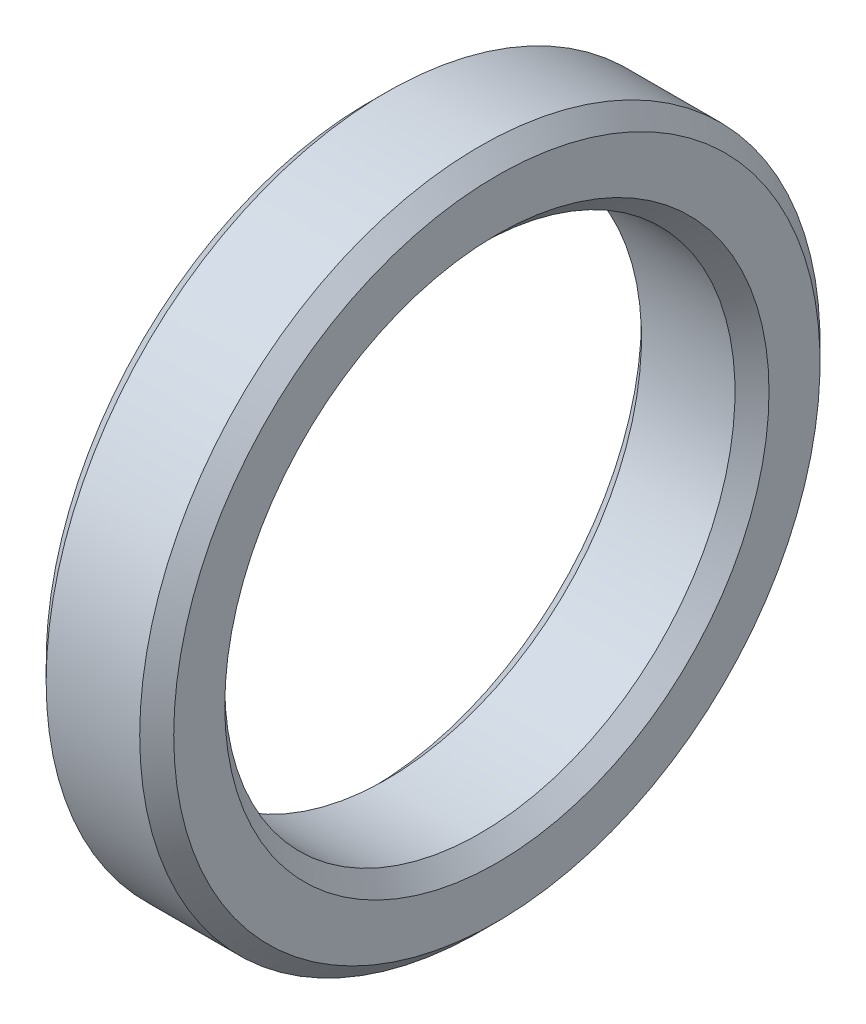
ISO-10303-21;
HEADER;
FILE_DESCRIPTION(('STEP AP214'),'2;1');
FILE_NAME('part.step','',(''),(''),'','','');
FILE_SCHEMA(('AUTOMOTIVE_DESIGN { 1 0 10303 214 1 1 1 1 }'));
ENDSEC;
DATA;
#1=APPLICATION_CONTEXT('core data for automotive mechanical design processes');
#2=APPLICATION_PROTOCOL_DEFINITION('international standard','automotive_design',2000,#1);
#3=PRODUCT_CONTEXT('',#1,'mechanical');
#4=PRODUCT('Part','Part','',(#3));
#5=PRODUCT_RELATED_PRODUCT_CATEGORY('part','',(#4));
#6=PRODUCT_DEFINITION_FORMATION('','',#4);
#7=PRODUCT_DEFINITION_CONTEXT('part definition',#1,'design');
#8=PRODUCT_DEFINITION('design','',#6,#7);
#9=PRODUCT_DEFINITION_SHAPE('','',#8);
#10=(LENGTH_UNIT() NAMED_UNIT(*) SI_UNIT(.MILLI.,.METRE.));
#11=(NAMED_UNIT(*) PLANE_ANGLE_UNIT() SI_UNIT($,.RADIAN.));
#12=(NAMED_UNIT(*) SI_UNIT($,.STERADIAN.) SOLID_ANGLE_UNIT());
#13=UNCERTAINTY_MEASURE_WITH_UNIT(LENGTH_MEASURE(1.E-05),#10,'distance_accuracy_value','');
#14=(GEOMETRIC_REPRESENTATION_CONTEXT(3) GLOBAL_UNCERTAINTY_ASSIGNED_CONTEXT((#13)) GLOBAL_UNIT_ASSIGNED_CONTEXT((#10,
#11,#12)) REPRESENTATION_CONTEXT('',''));
#15=CARTESIAN_POINT('',(0.,0.,0.));
#16=DIRECTION('',(0.,0.,1.));
#17=DIRECTION('',(1.,0.,0.));
#18=AXIS2_PLACEMENT_3D('',#15,#16,#17);
#19=CARTESIAN_POINT('',(0.,3.,0.));
#20=DIRECTION('',(1.,0.,0.));
#21=DIRECTION('',(0.,0.,-1.));
#22=AXIS2_PLACEMENT_3D('',#19,#20,#21);
#23=PLANE('',#22);
#24=CARTESIAN_POINT('',(0.,0.,0.));
#25=DIRECTION('',(1.,0.,0.));
#26=DIRECTION('',(0.,0.,-1.));
#27=AXIS2_PLACEMENT_3D('',#24,#25,#26);
#28=CIRCLE('',#27,3.2);
#29=CARTESIAN_POINT('',(0.,0.,3.2));
#30=VERTEX_POINT('',#29);
#31=EDGE_CURVE('E66',#30,#30,#28,.T.);
#32=ORIENTED_EDGE('',*,*,#31,.T.);
#33=EDGE_LOOP('',(#32));
#34=FACE_BOUND('',#33,.T.);
#35=CARTESIAN_POINT('',(0.,0.,0.));
#36=DIRECTION('',(1.,0.,0.));
#37=DIRECTION('',(0.,0.,-1.));
#38=AXIS2_PLACEMENT_3D('',#35,#36,#37);
#39=CIRCLE('',#38,3.8);
#40=CARTESIAN_POINT('',(0.,0.,-3.8));
#41=VERTEX_POINT('',#40);
#42=EDGE_CURVE('E70',#41,#41,#39,.F.);
#43=ORIENTED_EDGE('',*,*,#42,.T.);
#44=EDGE_LOOP('',(#43));
#45=FACE_BOUND('',#44,.T.);
#46=ADVANCED_FACE('F40',(#34,#45),#23,.F.);
#47=CARTESIAN_POINT('',(0.,0.,0.));
#48=DIRECTION('',(-1.,0.,0.));
#49=DIRECTION('',(0.,0.,1.));
#50=AXIS2_PLACEMENT_3D('',#47,#48,#49);
#51=CYLINDRICAL_SURFACE('',#50,4.);
#52=CARTESIAN_POINT('',(0.199999999999995,0.,0.));
#53=DIRECTION('',(1.,0.,0.));
#54=DIRECTION('',(0.,0.,-1.));
#55=AXIS2_PLACEMENT_3D('',#52,#53,#54);
#56=CIRCLE('',#55,4.);
#57=CARTESIAN_POINT('',(0.199999999999995,0.,-4.));
#58=VERTEX_POINT('',#57);
#59=EDGE_CURVE('E54',#58,#58,#56,.T.);
#60=ORIENTED_EDGE('',*,*,#59,.T.);
#61=EDGE_LOOP('',(#60));
#62=FACE_BOUND('',#61,.T.);
#63=CARTESIAN_POINT('',(1.3,0.,0.));
#64=DIRECTION('',(-1.,0.,0.));
#65=DIRECTION('',(0.,0.,1.));
#66=AXIS2_PLACEMENT_3D('',#63,#64,#65);
#67=CIRCLE('',#66,4.);
#68=CARTESIAN_POINT('',(1.3,0.,4.));
#69=VERTEX_POINT('',#68);
#70=EDGE_CURVE('E60',#69,#69,#67,.T.);
#71=ORIENTED_EDGE('',*,*,#70,.T.);
#72=EDGE_LOOP('',(#71));
#73=FACE_BOUND('',#72,.T.);
#74=ADVANCED_FACE('F99',(#62,#73),#51,.T.);
#75=CARTESIAN_POINT('',(1.5,3.,0.));
#76=DIRECTION('',(-1.,0.,0.));
#77=DIRECTION('',(0.,0.,1.));
#78=AXIS2_PLACEMENT_3D('',#75,#76,#77);
#79=PLANE('',#78);
#80=CARTESIAN_POINT('',(1.5,0.,0.));
#81=DIRECTION('',(-1.,0.,0.));
#82=DIRECTION('',(0.,0.,1.));
#83=AXIS2_PLACEMENT_3D('',#80,#81,#82);
#84=CIRCLE('',#83,3.2);
#85=CARTESIAN_POINT('',(1.5,0.,3.2));
#86=VERTEX_POINT('',#85);
#87=EDGE_CURVE('E10',#86,#86,#84,.T.);
#88=ORIENTED_EDGE('',*,*,#87,.T.);
#89=EDGE_LOOP('',(#88));
#90=FACE_BOUND('',#89,.T.);
#91=CARTESIAN_POINT('',(1.5,0.,0.));
#92=DIRECTION('',(-1.,0.,0.));
#93=DIRECTION('',(0.,0.,1.));
#94=AXIS2_PLACEMENT_3D('',#91,#92,#93);
#95=CIRCLE('',#94,3.8);
#96=CARTESIAN_POINT('',(1.5,0.,3.8));
#97=VERTEX_POINT('',#96);
#98=EDGE_CURVE('E48',#97,#97,#95,.F.);
#99=ORIENTED_EDGE('',*,*,#98,.T.);
#100=EDGE_LOOP('',(#99));
#101=FACE_BOUND('',#100,.T.);
#102=ADVANCED_FACE('F105',(#90,#101),#79,.F.);
#103=CARTESIAN_POINT('',(0.,0.,0.));
#104=DIRECTION('',(-1.,0.,0.));
#105=DIRECTION('',(0.,0.,1.));
#106=AXIS2_PLACEMENT_3D('',#103,#104,#105);
#107=CYLINDRICAL_SURFACE('',#106,3.);
#108=CARTESIAN_POINT('',(0.199999999999999,0.,0.));
#109=DIRECTION('',(1.,0.,0.));
#110=DIRECTION('',(0.,0.,-1.));
#111=AXIS2_PLACEMENT_3D('',#108,#109,#110);
#112=CIRCLE('',#111,3.);
#113=CARTESIAN_POINT('',(0.199999999999999,0.,3.));
#114=VERTEX_POINT('',#113);
#115=EDGE_CURVE('E74',#114,#114,#112,.F.);
#116=ORIENTED_EDGE('',*,*,#115,.T.);
#117=EDGE_LOOP('',(#116));
#118=FACE_BOUND('',#117,.T.);
#119=CARTESIAN_POINT('',(1.3,0.,0.));
#120=DIRECTION('',(-1.,0.,0.));
#121=DIRECTION('',(0.,0.,1.));
#122=AXIS2_PLACEMENT_3D('',#119,#120,#121);
#123=CIRCLE('',#122,3.);
#124=CARTESIAN_POINT('',(1.3,0.,3.));
#125=VERTEX_POINT('',#124);
#126=EDGE_CURVE('E78',#125,#125,#123,.F.);
#127=ORIENTED_EDGE('',*,*,#126,.T.);
#128=EDGE_LOOP('',(#127));
#129=FACE_BOUND('',#128,.T.);
#130=ADVANCED_FACE('F84',(#118,#129),#107,.F.);
#131=CARTESIAN_POINT('',(0.199999999999999,0.,0.));
#132=DIRECTION('',(-1.,0.,0.));
#133=DIRECTION('',(0.,0.,1.));
#134=AXIS2_PLACEMENT_3D('',#131,#132,#133);
#135=CONICAL_SURFACE('',#134,3.,0.785398163397449);
#136=CARTESIAN_POINT('',(0.,0.,3.2));
#137=CARTESIAN_POINT('',(0.00208333333333336,0.,3.19791666666667));
#138=CARTESIAN_POINT('',(0.00416666666666668,0.,3.19583333333333));
#139=CARTESIAN_POINT('',(0.00833333333333331,0.,3.19166666666667));
#140=CARTESIAN_POINT('',(0.0104166666666666,0.,3.18958333333333));
#141=CARTESIAN_POINT('',(0.0145833333333332,0.,3.18541666666667));
#142=CARTESIAN_POINT('',(0.0166666666666665,0.,3.18333333333333));
#143=CARTESIAN_POINT('',(0.0208333333333332,0.,3.17916666666667));
#144=CARTESIAN_POINT('',(0.0229166666666666,0.,3.17708333333333));
#145=CARTESIAN_POINT('',(0.0270833333333332,0.,3.17291666666667));
#146=CARTESIAN_POINT('',(0.0291666666666665,0.,3.17083333333333));
#147=CARTESIAN_POINT('',(0.0333333333333332,0.,3.16666666666667));
#148=CARTESIAN_POINT('',(0.0354166666666666,0.,3.16458333333333));
#149=CARTESIAN_POINT('',(0.0395833333333332,0.,3.16041666666667));
#150=CARTESIAN_POINT('',(0.0416666666666665,0.,3.15833333333333));
#151=CARTESIAN_POINT('',(0.0458333333333331,0.,3.15416666666667));
#152=CARTESIAN_POINT('',(0.0479166666666665,0.,3.15208333333333));
#153=CARTESIAN_POINT('',(0.0520833333333332,0.,3.14791666666667));
#154=CARTESIAN_POINT('',(0.0541666666666665,0.,3.14583333333333));
#155=CARTESIAN_POINT('',(0.0583333333333331,0.,3.14166666666667));
#156=CARTESIAN_POINT('',(0.0604166666666664,0.,3.13958333333333));
#157=CARTESIAN_POINT('',(0.0645833333333331,0.,3.13541666666667));
#158=CARTESIAN_POINT('',(0.0666666666666664,0.,3.13333333333333));
#159=CARTESIAN_POINT('',(0.0708333333333331,0.,3.12916666666667));
#160=CARTESIAN_POINT('',(0.0729166666666664,0.,3.12708333333333));
#161=CARTESIAN_POINT('',(0.077083333333333,0.,3.12291666666667));
#162=CARTESIAN_POINT('',(0.0791666666666664,0.,3.12083333333333));
#163=CARTESIAN_POINT('',(0.083333333333333,0.,3.11666666666667));
#164=CARTESIAN_POINT('',(0.0854166666666663,0.,3.11458333333333));
#165=CARTESIAN_POINT('',(0.0895833333333329,0.,3.11041666666667));
#166=CARTESIAN_POINT('',(0.0916666666666663,0.,3.10833333333333));
#167=CARTESIAN_POINT('',(0.095833333333333,0.,3.10416666666667));
#168=CARTESIAN_POINT('',(0.0979166666666662,0.,3.10208333333333));
#169=CARTESIAN_POINT('',(0.102083333333333,0.,3.09791666666667));
#170=CARTESIAN_POINT('',(0.104166666666666,0.,3.09583333333333));
#171=CARTESIAN_POINT('',(0.108333333333333,0.,3.09166666666667));
#172=CARTESIAN_POINT('',(0.110416666666666,0.,3.08958333333333));
#173=CARTESIAN_POINT('',(0.114583333333333,0.,3.08541666666667));
#174=CARTESIAN_POINT('',(0.116666666666666,0.,3.08333333333333));
#175=CARTESIAN_POINT('',(0.120833333333333,0.,3.07916666666667));
#176=CARTESIAN_POINT('',(0.122916666666666,0.,3.07708333333333));
#177=CARTESIAN_POINT('',(0.127083333333333,0.,3.07291666666667));
#178=CARTESIAN_POINT('',(0.129166666666666,0.,3.07083333333333));
#179=CARTESIAN_POINT('',(0.133333333333333,0.,3.06666666666667));
#180=CARTESIAN_POINT('',(0.135416666666666,0.,3.06458333333333));
#181=CARTESIAN_POINT('',(0.139583333333333,0.,3.06041666666667));
#182=CARTESIAN_POINT('',(0.141666666666666,0.,3.05833333333333));
#183=CARTESIAN_POINT('',(0.145833333333333,0.,3.05416666666667));
#184=CARTESIAN_POINT('',(0.147916666666666,0.,3.05208333333333));
#185=CARTESIAN_POINT('',(0.152083333333333,0.,3.04791666666667));
#186=CARTESIAN_POINT('',(0.154166666666666,0.,3.04583333333333));
#187=CARTESIAN_POINT('',(0.158333333333333,0.,3.04166666666667));
#188=CARTESIAN_POINT('',(0.160416666666666,0.,3.03958333333333));
#189=CARTESIAN_POINT('',(0.164583333333333,0.,3.03541666666667));
#190=CARTESIAN_POINT('',(0.166666666666666,0.,3.03333333333333));
#191=CARTESIAN_POINT('',(0.170833333333333,0.,3.02916666666667));
#192=CARTESIAN_POINT('',(0.172916666666666,0.,3.02708333333333));
#193=CARTESIAN_POINT('',(0.177083333333333,0.,3.02291666666667));
#194=CARTESIAN_POINT('',(0.179166666666666,0.,3.02083333333333));
#195=CARTESIAN_POINT('',(0.183333333333333,0.,3.01666666666667));
#196=CARTESIAN_POINT('',(0.185416666666666,0.,3.01458333333333));
#197=CARTESIAN_POINT('',(0.189583333333333,0.,3.01041666666667));
#198=CARTESIAN_POINT('',(0.191666666666666,0.,3.00833333333333));
#199=CARTESIAN_POINT('',(0.195833333333333,0.,3.00416666666667));
#200=CARTESIAN_POINT('',(0.197916666666666,0.,3.00208333333333));
#201=CARTESIAN_POINT('',(0.199999999999999,0.,3.));
#202=B_SPLINE_CURVE_WITH_KNOTS('',3,(#136,#137,#138,#139,#140,#141,#142,#143,#144,#145,#146,
#147,#148,#149,#150,#151,#152,#153,#154,#155,#156,#157,#158,#159,#160,#161,#162,#163,#164,#165,
#166,#167,#168,#169,#170,#171,#172,#173,#174,#175,#176,#177,#178,#179,#180,#181,#182,#183,#184,
#185,#186,#187,#188,#189,#190,#191,#192,#193,#194,#195,#196,#197,#198,#199,#200,#201),
.UNSPECIFIED.,.F.,.F.,(4,2,2,2,2,2,2,2,2,2,2,2,2,2,2,2,2,2,2,2,2,2,2,2,2,2,2,2,2,2,2,2,4),(0.,
0.00883883476483166,0.0176776695296636,0.0265165042944956,0.0353553390593272,0.0441941738241592,
0.0530330085889908,0.0618718433538228,0.0707106781186544,0.0795495128834864,0.0883883476483183,
0.09722718241315,0.106066017177982,0.114904851942814,0.123743686707646,0.132582521472477,
0.141421356237309,0.150260191002141,0.159099025766973,0.167937860531805,0.176776695296636,
0.185615530061468,0.1944543648263,0.203293199591132,0.212132034355964,0.220970869120796,
0.229809703885627,0.238648538650459,0.247487373415291,0.256326208180123,0.265165042944955,
0.274003877709786,0.282842712474618),.UNSPECIFIED.);
#203=EDGE_CURVE('BSEAM95',#30,#114,#202,.T.);
#204=ORIENTED_EDGE('',*,*,#31,.F.);
#205=ORIENTED_EDGE('',*,*,#115,.F.);
#206=ORIENTED_EDGE('',*,*,#203,.T.);
#207=ORIENTED_EDGE('',*,*,#203,.F.);
#208=EDGE_LOOP('',(#204,#206,#205,#207));
#209=FACE_BOUND('',#208,.T.);
#210=ADVANCED_FACE('F95',(#209),#135,.F.);
#211=CARTESIAN_POINT('',(0.,0.,0.));
#212=DIRECTION('',(1.,0.,0.));
#213=DIRECTION('',(0.,0.,-1.));
#214=AXIS2_PLACEMENT_3D('',#211,#212,#213);
#215=CONICAL_SURFACE('',#214,3.8,0.785398163397448);
#216=ORIENTED_EDGE('',*,*,#59,.F.);
#217=EDGE_LOOP('',(#216));
#218=FACE_BOUND('',#217,.T.);
#219=ORIENTED_EDGE('',*,*,#42,.F.);
#220=EDGE_LOOP('',(#219));
#221=FACE_BOUND('',#220,.T.);
#222=ADVANCED_FACE('F89',(#218,#221),#215,.T.);
#223=CARTESIAN_POINT('',(1.5,0.,0.));
#224=DIRECTION('',(1.,0.,0.));
#225=DIRECTION('',(0.,0.,-1.));
#226=AXIS2_PLACEMENT_3D('',#223,#224,#225);
#227=CONICAL_SURFACE('',#226,3.2,0.785398163397443);
#228=ORIENTED_EDGE('',*,*,#126,.F.);
#229=EDGE_LOOP('',(#228));
#230=FACE_BOUND('',#229,.T.);
#231=ORIENTED_EDGE('',*,*,#87,.F.);
#232=EDGE_LOOP('',(#231));
#233=FACE_BOUND('',#232,.T.);
#234=ADVANCED_FACE('F86',(#230,#233),#227,.F.);
#235=CARTESIAN_POINT('',(1.3,0.,0.));
#236=DIRECTION('',(-1.,0.,0.));
#237=DIRECTION('',(0.,0.,1.));
#238=AXIS2_PLACEMENT_3D('',#235,#236,#237);
#239=CONICAL_SURFACE('',#238,4.,0.785398163397453);
#240=CARTESIAN_POINT('',(1.5,0.,3.8));
#241=CARTESIAN_POINT('',(1.49791666666667,0.,3.80208333333333));
#242=CARTESIAN_POINT('',(1.49583333333333,0.,3.80416666666667));
#243=CARTESIAN_POINT('',(1.49166666666667,0.,3.80833333333333));
#244=CARTESIAN_POINT('',(1.48958333333333,0.,3.81041666666667));
#245=CARTESIAN_POINT('',(1.48541666666667,0.,3.81458333333333));
#246=CARTESIAN_POINT('',(1.48333333333333,0.,3.81666666666667));
#247=CARTESIAN_POINT('',(1.47916666666667,0.,3.82083333333333));
#248=CARTESIAN_POINT('',(1.47708333333333,0.,3.82291666666667));
#249=CARTESIAN_POINT('',(1.47291666666667,0.,3.82708333333333));
#250=CARTESIAN_POINT('',(1.47083333333333,0.,3.82916666666667));
#251=CARTESIAN_POINT('',(1.46666666666667,0.,3.83333333333333));
#252=CARTESIAN_POINT('',(1.46458333333333,0.,3.83541666666667));
#253=CARTESIAN_POINT('',(1.46041666666667,0.,3.83958333333333));
#254=CARTESIAN_POINT('',(1.45833333333333,0.,3.84166666666667));
#255=CARTESIAN_POINT('',(1.45416666666667,0.,3.84583333333333));
#256=CARTESIAN_POINT('',(1.45208333333333,0.,3.84791666666667));
#257=CARTESIAN_POINT('',(1.44791666666667,0.,3.85208333333333));
#258=CARTESIAN_POINT('',(1.44583333333333,0.,3.85416666666667));
#259=CARTESIAN_POINT('',(1.44166666666667,0.,3.85833333333333));
#260=CARTESIAN_POINT('',(1.43958333333333,0.,3.86041666666667));
#261=CARTESIAN_POINT('',(1.43541666666667,0.,3.86458333333333));
#262=CARTESIAN_POINT('',(1.43333333333333,0.,3.86666666666667));
#263=CARTESIAN_POINT('',(1.42916666666667,0.,3.87083333333333));
#264=CARTESIAN_POINT('',(1.42708333333333,0.,3.87291666666667));
#265=CARTESIAN_POINT('',(1.42291666666667,0.,3.87708333333333));
#266=CARTESIAN_POINT('',(1.42083333333333,0.,3.87916666666667));
#267=CARTESIAN_POINT('',(1.41666666666667,0.,3.88333333333333));
#268=CARTESIAN_POINT('',(1.41458333333333,0.,3.88541666666667));
#269=CARTESIAN_POINT('',(1.41041666666667,0.,3.88958333333333));
#270=CARTESIAN_POINT('',(1.40833333333333,0.,3.89166666666667));
#271=CARTESIAN_POINT('',(1.40416666666667,0.,3.89583333333333));
#272=CARTESIAN_POINT('',(1.40208333333333,0.,3.89791666666667));
#273=CARTESIAN_POINT('',(1.39791666666667,0.,3.90208333333333));
#274=CARTESIAN_POINT('',(1.39583333333333,0.,3.90416666666667));
#275=CARTESIAN_POINT('',(1.39166666666667,0.,3.90833333333333));
#276=CARTESIAN_POINT('',(1.38958333333333,0.,3.91041666666667));
#277=CARTESIAN_POINT('',(1.38541666666667,0.,3.91458333333333));
#278=CARTESIAN_POINT('',(1.38333333333333,0.,3.91666666666667));
#279=CARTESIAN_POINT('',(1.37916666666667,0.,3.92083333333333));
#280=CARTESIAN_POINT('',(1.37708333333333,0.,3.92291666666667));
#281=CARTESIAN_POINT('',(1.37291666666667,0.,3.92708333333333));
#282=CARTESIAN_POINT('',(1.37083333333333,0.,3.92916666666667));
#283=CARTESIAN_POINT('',(1.36666666666667,0.,3.93333333333333));
#284=CARTESIAN_POINT('',(1.36458333333333,0.,3.93541666666667));
#285=CARTESIAN_POINT('',(1.36041666666667,0.,3.93958333333333));
#286=CARTESIAN_POINT('',(1.35833333333333,0.,3.94166666666667));
#287=CARTESIAN_POINT('',(1.35416666666667,0.,3.94583333333333));
#288=CARTESIAN_POINT('',(1.35208333333333,0.,3.94791666666667));
#289=CARTESIAN_POINT('',(1.34791666666667,0.,3.95208333333333));
#290=CARTESIAN_POINT('',(1.34583333333333,0.,3.95416666666667));
#291=CARTESIAN_POINT('',(1.34166666666667,0.,3.95833333333333));
#292=CARTESIAN_POINT('',(1.33958333333333,0.,3.96041666666667));
#293=CARTESIAN_POINT('',(1.33541666666667,0.,3.96458333333333));
#294=CARTESIAN_POINT('',(1.33333333333333,0.,3.96666666666667));
#295=CARTESIAN_POINT('',(1.32916666666667,0.,3.97083333333333));
#296=CARTESIAN_POINT('',(1.32708333333333,0.,3.97291666666667));
#297=CARTESIAN_POINT('',(1.32291666666667,0.,3.97708333333333));
#298=CARTESIAN_POINT('',(1.32083333333333,0.,3.97916666666667));
#299=CARTESIAN_POINT('',(1.31666666666667,0.,3.98333333333333));
#300=CARTESIAN_POINT('',(1.31458333333333,0.,3.98541666666667));
#301=CARTESIAN_POINT('',(1.31041666666667,0.,3.98958333333333));
#302=CARTESIAN_POINT('',(1.30833333333333,0.,3.99166666666667));
#303=CARTESIAN_POINT('',(1.30416666666667,0.,3.99583333333333));
#304=CARTESIAN_POINT('',(1.30208333333333,0.,3.99791666666667));
#305=CARTESIAN_POINT('',(1.3,0.,4.));
#306=B_SPLINE_CURVE_WITH_KNOTS('',3,(#240,#241,#242,#243,#244,#245,#246,#247,#248,#249,#250,
#251,#252,#253,#254,#255,#256,#257,#258,#259,#260,#261,#262,#263,#264,#265,#266,#267,#268,#269,
#270,#271,#272,#273,#274,#275,#276,#277,#278,#279,#280,#281,#282,#283,#284,#285,#286,#287,#288,
#289,#290,#291,#292,#293,#294,#295,#296,#297,#298,#299,#300,#301,#302,#303,#304,#305),
.UNSPECIFIED.,.F.,.F.,(4,2,2,2,2,2,2,2,2,2,2,2,2,2,2,2,2,2,2,2,2,2,2,2,2,2,2,2,2,2,2,2,4),(0.,
0.00883883476483164,0.0176776695296637,0.0265165042944957,0.0353553390593273,0.0441941738241593,
0.0530330085889912,0.0618718433538228,0.0707106781186548,0.0795495128834869,0.0883883476483185,
0.0972271824131505,0.106066017177982,0.114904851942814,0.123743686707646,0.132582521472478,
0.14142135623731,0.150260191002142,0.159099025766974,0.167937860531806,0.176776695296637,
0.185615530061469,0.194454364826301,0.203293199591133,0.212132034355965,0.220970869120797,
0.229809703885629,0.238648538650461,0.247487373415292,0.256326208180124,0.265165042944956,
0.274003877709788,0.28284271247462),.UNSPECIFIED.);
#307=EDGE_CURVE('BSEAM42',#97,#69,#306,.T.);
#308=ORIENTED_EDGE('',*,*,#98,.F.);
#309=ORIENTED_EDGE('',*,*,#70,.F.);
#310=ORIENTED_EDGE('',*,*,#307,.T.);
#311=ORIENTED_EDGE('',*,*,#307,.F.);
#312=EDGE_LOOP('',(#308,#310,#309,#311));
#313=FACE_BOUND('',#312,.T.);
#314=ADVANCED_FACE('F42',(#313),#239,.T.);
#315=CLOSED_SHELL('',(#46,#74,#102,#130,#210,#222,#234,#314));
#316=MANIFOLD_SOLID_BREP('B2',#315);
#317=ADVANCED_BREP_SHAPE_REPRESENTATION('',(#18,#316),#14);
#318=SHAPE_DEFINITION_REPRESENTATION(#9,#317);
ENDSEC;
END-ISO-10303-21;
